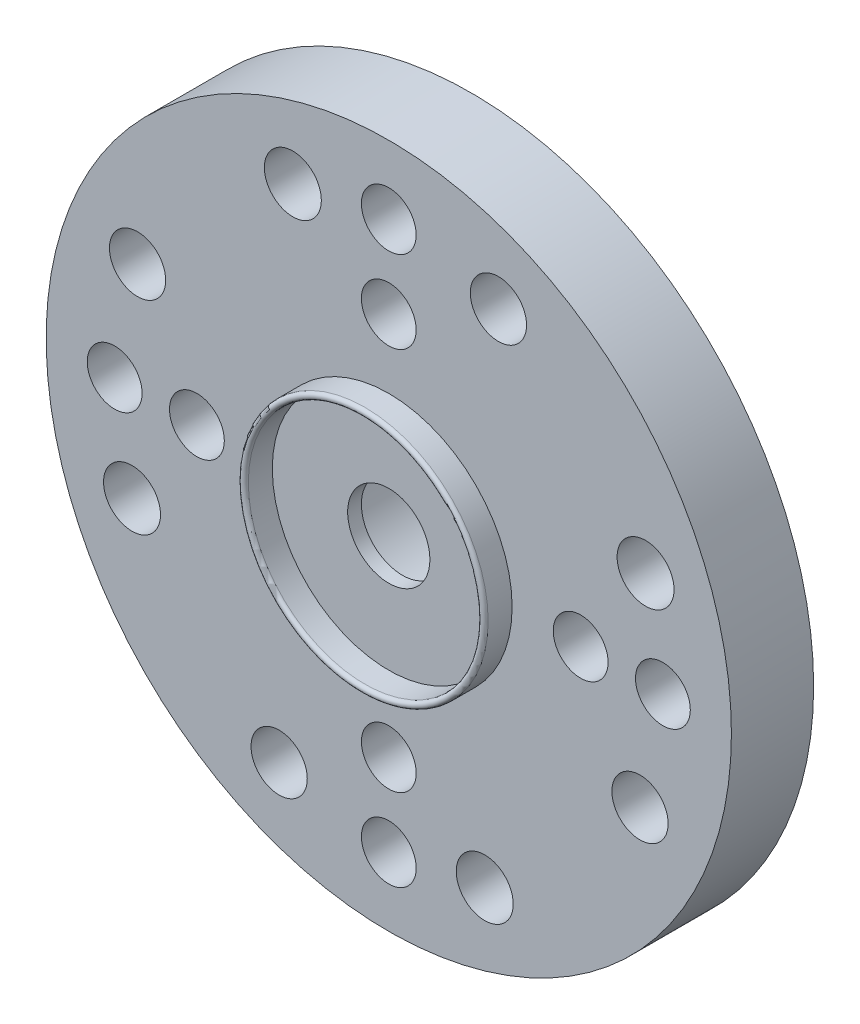
ISO-10303-21;
HEADER;
FILE_DESCRIPTION(('STEP AP214'),'2;1');
FILE_NAME('part.step','',(''),(''),'','','');
FILE_SCHEMA(('AUTOMOTIVE_DESIGN { 1 0 10303 214 1 1 1 1 }'));
ENDSEC;
DATA;
#1=APPLICATION_CONTEXT('core data for automotive mechanical design processes');
#2=APPLICATION_PROTOCOL_DEFINITION('international standard','automotive_design',2000,#1);
#3=PRODUCT_CONTEXT('',#1,'mechanical');
#4=PRODUCT('Part','Part','',(#3));
#5=PRODUCT_RELATED_PRODUCT_CATEGORY('part','',(#4));
#6=PRODUCT_DEFINITION_FORMATION('','',#4);
#7=PRODUCT_DEFINITION_CONTEXT('part definition',#1,'design');
#8=PRODUCT_DEFINITION('design','',#6,#7);
#9=PRODUCT_DEFINITION_SHAPE('','',#8);
#10=(LENGTH_UNIT() NAMED_UNIT(*) SI_UNIT(.MILLI.,.METRE.));
#11=(NAMED_UNIT(*) PLANE_ANGLE_UNIT() SI_UNIT($,.RADIAN.));
#12=(NAMED_UNIT(*) SI_UNIT($,.STERADIAN.) SOLID_ANGLE_UNIT());
#13=UNCERTAINTY_MEASURE_WITH_UNIT(LENGTH_MEASURE(1.E-05),#10,'distance_accuracy_value','');
#14=(GEOMETRIC_REPRESENTATION_CONTEXT(3) GLOBAL_UNCERTAINTY_ASSIGNED_CONTEXT((#13)) GLOBAL_UNIT_ASSIGNED_CONTEXT((#10,
#11,#12)) REPRESENTATION_CONTEXT('',''));
#15=CARTESIAN_POINT('',(0.,0.,0.));
#16=DIRECTION('',(0.,0.,1.));
#17=DIRECTION('',(1.,0.,0.));
#18=AXIS2_PLACEMENT_3D('',#15,#16,#17);
#19=CARTESIAN_POINT('',(0.,0.,3.875));
#20=DIRECTION('',(0.,0.,1.));
#21=DIRECTION('',(1.,0.,0.));
#22=AXIS2_PLACEMENT_3D('',#19,#20,#21);
#23=TOROIDAL_SURFACE('',#22,4.375,0.125);
#24=CARTESIAN_POINT('',(0.,0.,3.875));
#25=DIRECTION('',(0.,0.,1.));
#26=DIRECTION('',(1.,0.,0.));
#27=AXIS2_PLACEMENT_3D('',#24,#25,#26);
#28=CIRCLE('',#27,4.5);
#29=CARTESIAN_POINT('',(4.5,0.,3.875));
#30=VERTEX_POINT('',#29);
#31=EDGE_CURVE('E47',#30,#30,#28,.F.);
#32=ORIENTED_EDGE('',*,*,#31,.F.);
#33=EDGE_LOOP('',(#32));
#34=FACE_BOUND('',#33,.T.);
#35=CARTESIAN_POINT('',(0.,0.,3.875));
#36=DIRECTION('',(0.,0.,1.));
#37=DIRECTION('',(1.,0.,0.));
#38=AXIS2_PLACEMENT_3D('',#35,#36,#37);
#39=CIRCLE('',#38,4.25);
#40=CARTESIAN_POINT('',(4.25,0.,3.875));
#41=VERTEX_POINT('',#40);
#42=EDGE_CURVE('E10',#41,#41,#39,.T.);
#43=ORIENTED_EDGE('',*,*,#42,.F.);
#44=EDGE_LOOP('',(#43));
#45=FACE_BOUND('',#44,.T.);
#46=ADVANCED_FACE('F39',(#34,#45),#23,.T.);
#47=CARTESIAN_POINT('',(0.,0.,3.));
#48=DIRECTION('',(0.,0.,1.));
#49=DIRECTION('',(1.,0.,0.));
#50=AXIS2_PLACEMENT_3D('',#47,#48,#49);
#51=PLANE('',#50);
#52=CARTESIAN_POINT('',(0.,0.,3.));
#53=DIRECTION('',(0.,0.,1.));
#54=DIRECTION('',(1.,0.,0.));
#55=AXIS2_PLACEMENT_3D('',#52,#53,#54);
#56=CIRCLE('',#55,1.5);
#57=CARTESIAN_POINT('',(1.5,0.,3.));
#58=VERTEX_POINT('',#57);
#59=EDGE_CURVE('E68',#58,#58,#56,.T.);
#60=ORIENTED_EDGE('',*,*,#59,.F.);
#61=EDGE_LOOP('',(#60));
#62=FACE_BOUND('',#61,.T.);
#63=CARTESIAN_POINT('',(0.,0.,3.));
#64=DIRECTION('',(0.,0.,1.));
#65=DIRECTION('',(1.,0.,0.));
#66=AXIS2_PLACEMENT_3D('',#63,#64,#65);
#67=CIRCLE('',#66,4.25);
#68=CARTESIAN_POINT('',(4.25,0.,3.));
#69=VERTEX_POINT('',#68);
#70=EDGE_CURVE('E52',#69,#69,#67,.F.);
#71=ORIENTED_EDGE('',*,*,#70,.F.);
#72=EDGE_LOOP('',(#71));
#73=FACE_BOUND('',#72,.T.);
#74=ADVANCED_FACE('F234',(#62,#73),#51,.T.);
#75=CARTESIAN_POINT('',(0.,0.,0.));
#76=DIRECTION('',(0.,0.,1.));
#77=DIRECTION('',(1.,0.,0.));
#78=AXIS2_PLACEMENT_3D('',#75,#76,#77);
#79=PLANE('',#78);
#80=CARTESIAN_POINT('',(7.0000000000007,1.28837694184105E-12,0.));
#81=DIRECTION('',(0.,0.,1.));
#82=DIRECTION('',(1.,0.,0.));
#83=AXIS2_PLACEMENT_3D('',#80,#81,#82);
#84=CIRCLE('',#83,1.00000000000105);
#85=CARTESIAN_POINT('',(8.00000000000175,1.28837694184105E-12,0.));
#86=VERTEX_POINT('',#85);
#87=EDGE_CURVE('E95',#86,#86,#84,.T.);
#88=ORIENTED_EDGE('',*,*,#87,.T.);
#89=EDGE_LOOP('',(#88));
#90=FACE_BOUND('',#89,.T.);
#91=CARTESIAN_POINT('',(9.16515138991238,-3.99999999999871,0.));
#92=DIRECTION('',(0.,0.,1.));
#93=DIRECTION('',(1.,0.,0.));
#94=AXIS2_PLACEMENT_3D('',#91,#92,#93);
#95=CIRCLE('',#94,1.02583719279547);
#96=CARTESIAN_POINT('',(10.1909885827078,-3.99999999999871,0.));
#97=VERTEX_POINT('',#96);
#98=EDGE_CURVE('E99',#97,#97,#95,.T.);
#99=ORIENTED_EDGE('',*,*,#98,.T.);
#100=EDGE_LOOP('',(#99));
#101=FACE_BOUND('',#100,.T.);
#102=CARTESIAN_POINT('',(9.3674969975983,3.50000000000129,0.));
#103=DIRECTION('',(0.,0.,1.));
#104=DIRECTION('',(1.,0.,0.));
#105=AXIS2_PLACEMENT_3D('',#102,#103,#104);
#106=CIRCLE('',#105,1.03915751450506);
#107=CARTESIAN_POINT('',(10.4066545121034,3.50000000000129,0.));
#108=VERTEX_POINT('',#107);
#109=EDGE_CURVE('E103',#108,#108,#106,.T.);
#110=ORIENTED_EDGE('',*,*,#109,.T.);
#111=EDGE_LOOP('',(#110));
#112=FACE_BOUND('',#111,.T.);
#113=CARTESIAN_POINT('',(1.98838503019381E-12,-9.99999999999941,0.));
#114=DIRECTION('',(0.,0.,1.));
#115=DIRECTION('',(1.,0.,0.));
#116=AXIS2_PLACEMENT_3D('',#113,#114,#115);
#117=CIRCLE('',#116,1.00000000000214);
#118=CARTESIAN_POINT('',(1.00000000000413,-9.99999999999941,0.));
#119=VERTEX_POINT('',#118);
#120=EDGE_CURVE('E107',#119,#119,#117,.T.);
#121=ORIENTED_EDGE('',*,*,#120,.T.);
#122=EDGE_LOOP('',(#121));
#123=FACE_BOUND('',#122,.T.);
#124=CARTESIAN_POINT('',(0.,7.,0.));
#125=DIRECTION('',(0.,0.,1.));
#126=DIRECTION('',(1.,0.,0.));
#127=AXIS2_PLACEMENT_3D('',#124,#125,#126);
#128=CIRCLE('',#127,1.);
#129=CARTESIAN_POINT('',(1.,7.,0.));
#130=VERTEX_POINT('',#129);
#131=EDGE_CURVE('E111',#130,#130,#128,.T.);
#132=ORIENTED_EDGE('',*,*,#131,.T.);
#133=EDGE_LOOP('',(#132));
#134=FACE_BOUND('',#133,.T.);
#135=CARTESIAN_POINT('',(4.,9.16515138991168,0.));
#136=DIRECTION('',(0.,0.,1.));
#137=DIRECTION('',(1.,0.,0.));
#138=AXIS2_PLACEMENT_3D('',#135,#136,#137);
#139=CIRCLE('',#138,1.02583719279441);
#140=CARTESIAN_POINT('',(5.02583719279441,9.16515138991168,0.));
#141=VERTEX_POINT('',#140);
#142=EDGE_CURVE('E115',#141,#141,#139,.T.);
#143=ORIENTED_EDGE('',*,*,#142,.T.);
#144=EDGE_LOOP('',(#143));
#145=FACE_BOUND('',#144,.T.);
#146=CARTESIAN_POINT('',(-3.5,9.3674969975976,0.));
#147=DIRECTION('',(0.,0.,1.));
#148=DIRECTION('',(1.,0.,0.));
#149=AXIS2_PLACEMENT_3D('',#146,#147,#148);
#150=CIRCLE('',#149,1.03915751450399);
#151=CARTESIAN_POINT('',(-2.46084248549601,9.3674969975976,0.));
#152=VERTEX_POINT('',#151);
#153=EDGE_CURVE('E119',#152,#152,#150,.T.);
#154=ORIENTED_EDGE('',*,*,#153,.T.);
#155=EDGE_LOOP('',(#154));
#156=FACE_BOUND('',#155,.T.);
#157=CARTESIAN_POINT('',(10.0000000000007,1.28892803290067E-12,0.));
#158=DIRECTION('',(0.,0.,1.));
#159=DIRECTION('',(1.,0.,0.));
#160=AXIS2_PLACEMENT_3D('',#157,#158,#159);
#161=CIRCLE('',#160,1.00000000000106);
#162=CARTESIAN_POINT('',(11.0000000000018,1.28892803290067E-12,0.));
#163=VERTEX_POINT('',#162);
#164=EDGE_CURVE('E123',#163,#163,#161,.T.);
#165=ORIENTED_EDGE('',*,*,#164,.T.);
#166=EDGE_LOOP('',(#165));
#167=FACE_BOUND('',#166,.T.);
#168=CARTESIAN_POINT('',(-9.36749699759631,-3.5000000000007,0.));
#169=DIRECTION('',(0.,0.,1.));
#170=DIRECTION('',(1.,0.,0.));
#171=AXIS2_PLACEMENT_3D('',#168,#169,#170);
#172=CIRCLE('',#171,1.03915751450514);
#173=CARTESIAN_POINT('',(-8.32833948309117,-3.5000000000007,0.));
#174=VERTEX_POINT('',#173);
#175=EDGE_CURVE('E127',#174,#174,#172,.T.);
#176=ORIENTED_EDGE('',*,*,#175,.T.);
#177=EDGE_LOOP('',(#176));
#178=FACE_BOUND('',#177,.T.);
#179=CARTESIAN_POINT('',(-9.16515138991039,3.9999999999993,0.));
#180=DIRECTION('',(0.,0.,1.));
#181=DIRECTION('',(1.,0.,0.));
#182=AXIS2_PLACEMENT_3D('',#179,#180,#181);
#183=CIRCLE('',#182,1.02583719279554);
#184=CARTESIAN_POINT('',(-8.13931419711485,3.9999999999993,0.));
#185=VERTEX_POINT('',#184);
#186=EDGE_CURVE('E131',#185,#185,#183,.T.);
#187=ORIENTED_EDGE('',*,*,#186,.T.);
#188=EDGE_LOOP('',(#187));
#189=FACE_BOUND('',#188,.T.);
#190=CARTESIAN_POINT('',(-6.99999999999871,-6.9942821276834E-13,0.));
#191=DIRECTION('',(0.,0.,1.));
#192=DIRECTION('',(1.,0.,0.));
#193=AXIS2_PLACEMENT_3D('',#190,#191,#192);
#194=CIRCLE('',#193,1.00000000000112);
#195=CARTESIAN_POINT('',(-5.99999999999759,-6.9942821276834E-13,0.));
#196=VERTEX_POINT('',#195);
#197=EDGE_CURVE('E135',#196,#196,#194,.T.);
#198=ORIENTED_EDGE('',*,*,#197,.T.);
#199=EDGE_LOOP('',(#198));
#200=FACE_BOUND('',#199,.T.);
#201=CARTESIAN_POINT('',(1.98765024211432E-12,-6.99999999999941,0.));
#202=DIRECTION('',(0.,0.,1.));
#203=DIRECTION('',(1.,0.,0.));
#204=AXIS2_PLACEMENT_3D('',#201,#202,#203);
#205=CIRCLE('',#204,1.00000000000212);
#206=CARTESIAN_POINT('',(1.00000000000411,-6.99999999999941,0.));
#207=VERTEX_POINT('',#206);
#208=EDGE_CURVE('E139',#207,#207,#205,.T.);
#209=ORIENTED_EDGE('',*,*,#208,.T.);
#210=EDGE_LOOP('',(#209));
#211=FACE_BOUND('',#210,.T.);
#212=CARTESIAN_POINT('',(-3.99999999999801,-9.16515138991109,0.));
#213=DIRECTION('',(0.,0.,1.));
#214=DIRECTION('',(1.,0.,0.));
#215=AXIS2_PLACEMENT_3D('',#212,#213,#214);
#216=CIRCLE('',#215,1.02583719279654);
#217=CARTESIAN_POINT('',(-2.97416280720147,-9.16515138991109,0.));
#218=VERTEX_POINT('',#217);
#219=EDGE_CURVE('E143',#218,#218,#216,.T.);
#220=ORIENTED_EDGE('',*,*,#219,.T.);
#221=EDGE_LOOP('',(#220));
#222=FACE_BOUND('',#221,.T.);
#223=CARTESIAN_POINT('',(3.50000000000199,-9.36749699759701,0.));
#224=DIRECTION('',(0.,0.,1.));
#225=DIRECTION('',(1.,0.,0.));
#226=AXIS2_PLACEMENT_3D('',#223,#224,#225);
#227=CIRCLE('',#226,1.03915751450614);
#228=CARTESIAN_POINT('',(4.53915751450813,-9.36749699759701,0.));
#229=VERTEX_POINT('',#228);
#230=EDGE_CURVE('E147',#229,#229,#227,.T.);
#231=ORIENTED_EDGE('',*,*,#230,.T.);
#232=EDGE_LOOP('',(#231));
#233=FACE_BOUND('',#232,.T.);
#234=CARTESIAN_POINT('',(-9.99999999999871,-7.003466978677E-13,0.));
#235=DIRECTION('',(0.,0.,1.));
#236=DIRECTION('',(1.,0.,0.));
#237=AXIS2_PLACEMENT_3D('',#234,#235,#236);
#238=CIRCLE('',#237,1.00000000000115);
#239=CARTESIAN_POINT('',(-8.99999999999756,-7.003466978677E-13,0.));
#240=VERTEX_POINT('',#239);
#241=EDGE_CURVE('E151',#240,#240,#238,.T.);
#242=ORIENTED_EDGE('',*,*,#241,.T.);
#243=EDGE_LOOP('',(#242));
#244=FACE_BOUND('',#243,.T.);
#245=CARTESIAN_POINT('',(0.,10.,0.));
#246=DIRECTION('',(0.,0.,1.));
#247=DIRECTION('',(1.,0.,0.));
#248=AXIS2_PLACEMENT_3D('',#245,#246,#247);
#249=CIRCLE('',#248,1.);
#250=CARTESIAN_POINT('',(1.,10.,0.));
#251=VERTEX_POINT('',#250);
#252=EDGE_CURVE('E155',#251,#251,#249,.T.);
#253=ORIENTED_EDGE('',*,*,#252,.T.);
#254=EDGE_LOOP('',(#253));
#255=FACE_BOUND('',#254,.T.);
#256=CARTESIAN_POINT('',(0.,0.,0.));
#257=DIRECTION('',(0.,0.,1.));
#258=DIRECTION('',(1.,0.,0.));
#259=AXIS2_PLACEMENT_3D('',#256,#257,#258);
#260=CIRCLE('',#259,12.5);
#261=CARTESIAN_POINT('',(12.5,0.,0.));
#262=VERTEX_POINT('',#261);
#263=EDGE_CURVE('E70',#262,#262,#260,.T.);
#264=ORIENTED_EDGE('',*,*,#263,.F.);
#265=EDGE_LOOP('',(#264));
#266=FACE_BOUND('',#265,.T.);
#267=CARTESIAN_POINT('',(0.,0.,0.));
#268=DIRECTION('',(0.,0.,1.));
#269=DIRECTION('',(1.,0.,0.));
#270=AXIS2_PLACEMENT_3D('',#267,#268,#269);
#271=CIRCLE('',#270,4.5);
#272=CARTESIAN_POINT('',(4.5,0.,0.));
#273=VERTEX_POINT('',#272);
#274=EDGE_CURVE('E57',#273,#273,#271,.F.);
#275=ORIENTED_EDGE('',*,*,#274,.F.);
#276=EDGE_LOOP('',(#275));
#277=FACE_BOUND('',#276,.T.);
#278=ADVANCED_FACE('F251',(#90,#101,#112,#123,#134,#145,#156,#167,#178,#189,#200,#211,#222,#233,
#244,#255,#266,#277),#79,.F.);
#279=CARTESIAN_POINT('',(0.,0.,3.));
#280=DIRECTION('',(0.,0.,-1.));
#281=DIRECTION('',(-1.,0.,0.));
#282=AXIS2_PLACEMENT_3D('',#279,#280,#281);
#283=CYLINDRICAL_SURFACE('',#282,12.5);
#284=CARTESIAN_POINT('',(0.,0.,3.));
#285=DIRECTION('',(0.,0.,1.));
#286=DIRECTION('',(1.,0.,0.));
#287=AXIS2_PLACEMENT_3D('',#284,#285,#286);
#288=CIRCLE('',#287,12.5);
#289=CARTESIAN_POINT('',(12.5,0.,3.));
#290=VERTEX_POINT('',#289);
#291=EDGE_CURVE('E63',#290,#290,#288,.T.);
#292=ORIENTED_EDGE('',*,*,#291,.F.);
#293=EDGE_LOOP('',(#292));
#294=FACE_BOUND('',#293,.T.);
#295=ORIENTED_EDGE('',*,*,#263,.T.);
#296=EDGE_LOOP('',(#295));
#297=FACE_BOUND('',#296,.T.);
#298=ADVANCED_FACE('F231',(#294,#297),#283,.T.);
#299=CARTESIAN_POINT('',(7.0000000000007,1.28837694184105E-12,3.));
#300=DIRECTION('',(0.,0.,1.));
#301=DIRECTION('',(1.,0.,0.));
#302=AXIS2_PLACEMENT_3D('',#299,#300,#301);
#303=CIRCLE('',#302,1.00000000000105);
#304=CARTESIAN_POINT('',(8.00000000000175,1.28837694184105E-12,3.));
#305=VERTEX_POINT('',#304);
#306=EDGE_CURVE('E176',#305,#305,#303,.T.);
#307=ORIENTED_EDGE('',*,*,#306,.F.);
#308=EDGE_LOOP('',(#307));
#309=FACE_BOUND('',#308,.T.);
#310=CARTESIAN_POINT('',(9.16515138991238,-3.99999999999871,3.));
#311=DIRECTION('',(0.,0.,1.));
#312=DIRECTION('',(1.,0.,0.));
#313=AXIS2_PLACEMENT_3D('',#310,#311,#312);
#314=CIRCLE('',#313,1.02583719279547);
#315=CARTESIAN_POINT('',(10.1909885827078,-3.99999999999871,3.));
#316=VERTEX_POINT('',#315);
#317=EDGE_CURVE('E180',#316,#316,#314,.T.);
#318=ORIENTED_EDGE('',*,*,#317,.F.);
#319=EDGE_LOOP('',(#318));
#320=FACE_BOUND('',#319,.T.);
#321=CARTESIAN_POINT('',(9.3674969975983,3.50000000000129,3.));
#322=DIRECTION('',(0.,0.,1.));
#323=DIRECTION('',(1.,0.,0.));
#324=AXIS2_PLACEMENT_3D('',#321,#322,#323);
#325=CIRCLE('',#324,1.03915751450506);
#326=CARTESIAN_POINT('',(10.4066545121034,3.50000000000129,3.));
#327=VERTEX_POINT('',#326);
#328=EDGE_CURVE('E184',#327,#327,#325,.T.);
#329=ORIENTED_EDGE('',*,*,#328,.F.);
#330=EDGE_LOOP('',(#329));
#331=FACE_BOUND('',#330,.T.);
#332=CARTESIAN_POINT('',(1.98838503019381E-12,-9.99999999999941,3.));
#333=DIRECTION('',(0.,0.,1.));
#334=DIRECTION('',(1.,0.,0.));
#335=AXIS2_PLACEMENT_3D('',#332,#333,#334);
#336=CIRCLE('',#335,1.00000000000214);
#337=CARTESIAN_POINT('',(1.00000000000413,-9.99999999999941,3.));
#338=VERTEX_POINT('',#337);
#339=EDGE_CURVE('E188',#338,#338,#336,.T.);
#340=ORIENTED_EDGE('',*,*,#339,.F.);
#341=EDGE_LOOP('',(#340));
#342=FACE_BOUND('',#341,.T.);
#343=CARTESIAN_POINT('',(0.,7.,3.));
#344=DIRECTION('',(0.,0.,1.));
#345=DIRECTION('',(1.,0.,0.));
#346=AXIS2_PLACEMENT_3D('',#343,#344,#345);
#347=CIRCLE('',#346,1.);
#348=CARTESIAN_POINT('',(1.,7.,3.));
#349=VERTEX_POINT('',#348);
#350=EDGE_CURVE('E163',#349,#349,#347,.T.);
#351=ORIENTED_EDGE('',*,*,#350,.F.);
#352=EDGE_LOOP('',(#351));
#353=FACE_BOUND('',#352,.T.);
#354=CARTESIAN_POINT('',(4.,9.16515138991168,3.));
#355=DIRECTION('',(0.,0.,1.));
#356=DIRECTION('',(1.,0.,0.));
#357=AXIS2_PLACEMENT_3D('',#354,#355,#356);
#358=CIRCLE('',#357,1.02583719279441);
#359=CARTESIAN_POINT('',(5.02583719279441,9.16515138991168,3.));
#360=VERTEX_POINT('',#359);
#361=EDGE_CURVE('E164',#360,#360,#358,.T.);
#362=ORIENTED_EDGE('',*,*,#361,.F.);
#363=EDGE_LOOP('',(#362));
#364=FACE_BOUND('',#363,.T.);
#365=CARTESIAN_POINT('',(-3.5,9.3674969975976,3.));
#366=DIRECTION('',(0.,0.,1.));
#367=DIRECTION('',(1.,0.,0.));
#368=AXIS2_PLACEMENT_3D('',#365,#366,#367);
#369=CIRCLE('',#368,1.03915751450399);
#370=CARTESIAN_POINT('',(-2.46084248549601,9.3674969975976,3.));
#371=VERTEX_POINT('',#370);
#372=EDGE_CURVE('E168',#371,#371,#369,.T.);
#373=ORIENTED_EDGE('',*,*,#372,.F.);
#374=EDGE_LOOP('',(#373));
#375=FACE_BOUND('',#374,.T.);
#376=CARTESIAN_POINT('',(10.0000000000007,1.28892803290067E-12,3.));
#377=DIRECTION('',(0.,0.,1.));
#378=DIRECTION('',(1.,0.,0.));
#379=AXIS2_PLACEMENT_3D('',#376,#377,#378);
#380=CIRCLE('',#379,1.00000000000106);
#381=CARTESIAN_POINT('',(11.0000000000018,1.28892803290067E-12,3.));
#382=VERTEX_POINT('',#381);
#383=EDGE_CURVE('E172',#382,#382,#380,.T.);
#384=ORIENTED_EDGE('',*,*,#383,.F.);
#385=EDGE_LOOP('',(#384));
#386=FACE_BOUND('',#385,.T.);
#387=CARTESIAN_POINT('',(-9.36749699759631,-3.5000000000007,3.));
#388=DIRECTION('',(0.,0.,1.));
#389=DIRECTION('',(1.,0.,0.));
#390=AXIS2_PLACEMENT_3D('',#387,#388,#389);
#391=CIRCLE('',#390,1.03915751450514);
#392=CARTESIAN_POINT('',(-8.32833948309117,-3.5000000000007,3.));
#393=VERTEX_POINT('',#392);
#394=EDGE_CURVE('E212',#393,#393,#391,.T.);
#395=ORIENTED_EDGE('',*,*,#394,.F.);
#396=EDGE_LOOP('',(#395));
#397=FACE_BOUND('',#396,.T.);
#398=CARTESIAN_POINT('',(-9.16515138991039,3.9999999999993,3.));
#399=DIRECTION('',(0.,0.,1.));
#400=DIRECTION('',(1.,0.,0.));
#401=AXIS2_PLACEMENT_3D('',#398,#399,#400);
#402=CIRCLE('',#401,1.02583719279554);
#403=CARTESIAN_POINT('',(-8.13931419711485,3.9999999999993,3.));
#404=VERTEX_POINT('',#403);
#405=EDGE_CURVE('E216',#404,#404,#402,.T.);
#406=ORIENTED_EDGE('',*,*,#405,.F.);
#407=EDGE_LOOP('',(#406));
#408=FACE_BOUND('',#407,.T.);
#409=CARTESIAN_POINT('',(-6.99999999999871,-6.9942821276834E-13,3.));
#410=DIRECTION('',(0.,0.,1.));
#411=DIRECTION('',(1.,0.,0.));
#412=AXIS2_PLACEMENT_3D('',#409,#410,#411);
#413=CIRCLE('',#412,1.00000000000112);
#414=CARTESIAN_POINT('',(-5.99999999999759,-6.9942821276834E-13,3.));
#415=VERTEX_POINT('',#414);
#416=EDGE_CURVE('E208',#415,#415,#413,.T.);
#417=ORIENTED_EDGE('',*,*,#416,.F.);
#418=EDGE_LOOP('',(#417));
#419=FACE_BOUND('',#418,.T.);
#420=CARTESIAN_POINT('',(1.98765024211432E-12,-6.99999999999941,3.));
#421=DIRECTION('',(0.,0.,1.));
#422=DIRECTION('',(1.,0.,0.));
#423=AXIS2_PLACEMENT_3D('',#420,#421,#422);
#424=CIRCLE('',#423,1.00000000000212);
#425=CARTESIAN_POINT('',(1.00000000000411,-6.99999999999941,3.));
#426=VERTEX_POINT('',#425);
#427=EDGE_CURVE('E192',#426,#426,#424,.T.);
#428=ORIENTED_EDGE('',*,*,#427,.F.);
#429=EDGE_LOOP('',(#428));
#430=FACE_BOUND('',#429,.T.);
#431=CARTESIAN_POINT('',(-3.99999999999801,-9.16515138991109,3.));
#432=DIRECTION('',(0.,0.,1.));
#433=DIRECTION('',(1.,0.,0.));
#434=AXIS2_PLACEMENT_3D('',#431,#432,#433);
#435=CIRCLE('',#434,1.02583719279654);
#436=CARTESIAN_POINT('',(-2.97416280720147,-9.16515138991109,3.));
#437=VERTEX_POINT('',#436);
#438=EDGE_CURVE('E196',#437,#437,#435,.T.);
#439=ORIENTED_EDGE('',*,*,#438,.F.);
#440=EDGE_LOOP('',(#439));
#441=FACE_BOUND('',#440,.T.);
#442=CARTESIAN_POINT('',(3.50000000000199,-9.36749699759701,3.));
#443=DIRECTION('',(0.,0.,1.));
#444=DIRECTION('',(1.,0.,0.));
#445=AXIS2_PLACEMENT_3D('',#442,#443,#444);
#446=CIRCLE('',#445,1.03915751450614);
#447=CARTESIAN_POINT('',(4.53915751450813,-9.36749699759701,3.));
#448=VERTEX_POINT('',#447);
#449=EDGE_CURVE('E200',#448,#448,#446,.T.);
#450=ORIENTED_EDGE('',*,*,#449,.F.);
#451=EDGE_LOOP('',(#450));
#452=FACE_BOUND('',#451,.T.);
#453=CARTESIAN_POINT('',(-9.99999999999871,-7.003466978677E-13,3.));
#454=DIRECTION('',(0.,0.,1.));
#455=DIRECTION('',(1.,0.,0.));
#456=AXIS2_PLACEMENT_3D('',#453,#454,#455);
#457=CIRCLE('',#456,1.00000000000115);
#458=CARTESIAN_POINT('',(-8.99999999999756,-7.003466978677E-13,3.));
#459=VERTEX_POINT('',#458);
#460=EDGE_CURVE('E204',#459,#459,#457,.T.);
#461=ORIENTED_EDGE('',*,*,#460,.F.);
#462=EDGE_LOOP('',(#461));
#463=FACE_BOUND('',#462,.T.);
#464=CARTESIAN_POINT('',(0.,10.,3.));
#465=DIRECTION('',(0.,0.,1.));
#466=DIRECTION('',(1.,0.,0.));
#467=AXIS2_PLACEMENT_3D('',#464,#465,#466);
#468=CIRCLE('',#467,1.);
#469=CARTESIAN_POINT('',(1.,10.,3.));
#470=VERTEX_POINT('',#469);
#471=EDGE_CURVE('E159',#470,#470,#468,.T.);
#472=ORIENTED_EDGE('',*,*,#471,.F.);
#473=EDGE_LOOP('',(#472));
#474=FACE_BOUND('',#473,.T.);
#475=CARTESIAN_POINT('',(0.,0.,3.));
#476=DIRECTION('',(0.,0.,1.));
#477=DIRECTION('',(1.,0.,0.));
#478=AXIS2_PLACEMENT_3D('',#475,#476,#477);
#479=CIRCLE('',#478,4.5);
#480=CARTESIAN_POINT('',(4.5,0.,3.));
#481=VERTEX_POINT('',#480);
#482=EDGE_CURVE('E91',#481,#481,#479,.T.);
#483=ORIENTED_EDGE('',*,*,#482,.F.);
#484=EDGE_LOOP('',(#483));
#485=FACE_BOUND('',#484,.T.);
#486=ORIENTED_EDGE('',*,*,#291,.T.);
#487=EDGE_LOOP('',(#486));
#488=FACE_BOUND('',#487,.T.);
#489=ADVANCED_FACE('F227',(#309,#320,#331,#342,#353,#364,#375,#386,#397,#408,#419,#430,#441,
#452,#463,#474,#485,#488),#51,.T.);
#490=CARTESIAN_POINT('',(0.,0.,2.5));
#491=DIRECTION('',(0.,0.,-1.));
#492=DIRECTION('',(-1.,0.,0.));
#493=AXIS2_PLACEMENT_3D('',#490,#491,#492);
#494=CYLINDRICAL_SURFACE('',#493,3.);
#495=CARTESIAN_POINT('',(0.,0.,2.5));
#496=DIRECTION('',(0.,0.,1.));
#497=DIRECTION('',(1.,0.,0.));
#498=AXIS2_PLACEMENT_3D('',#495,#496,#497);
#499=CIRCLE('',#498,3.);
#500=CARTESIAN_POINT('',(3.,0.,2.5));
#501=VERTEX_POINT('',#500);
#502=EDGE_CURVE('E74',#501,#501,#499,.T.);
#503=ORIENTED_EDGE('',*,*,#502,.T.);
#504=EDGE_LOOP('',(#503));
#505=FACE_BOUND('',#504,.T.);
#506=CARTESIAN_POINT('',(0.,0.,-4.));
#507=DIRECTION('',(0.,0.,-1.));
#508=DIRECTION('',(-1.,0.,0.));
#509=AXIS2_PLACEMENT_3D('',#506,#507,#508);
#510=CIRCLE('',#509,3.);
#511=CARTESIAN_POINT('',(-3.,0.,-4.));
#512=VERTEX_POINT('',#511);
#513=EDGE_CURVE('E87',#512,#512,#510,.T.);
#514=ORIENTED_EDGE('',*,*,#513,.T.);
#515=EDGE_LOOP('',(#514));
#516=FACE_BOUND('',#515,.T.);
#517=ADVANCED_FACE('F230',(#505,#516),#494,.F.);
#518=CARTESIAN_POINT('',(0.,0.,2.5));
#519=DIRECTION('',(0.,0.,1.));
#520=DIRECTION('',(1.,0.,0.));
#521=AXIS2_PLACEMENT_3D('',#518,#519,#520);
#522=PLANE('',#521);
#523=CARTESIAN_POINT('',(0.,0.,2.5));
#524=DIRECTION('',(0.,0.,1.));
#525=DIRECTION('',(1.,0.,0.));
#526=AXIS2_PLACEMENT_3D('',#523,#524,#525);
#527=CIRCLE('',#526,1.5);
#528=CARTESIAN_POINT('',(1.5,0.,2.5));
#529=VERTEX_POINT('',#528);
#530=EDGE_CURVE('E64',#529,#529,#527,.T.);
#531=ORIENTED_EDGE('',*,*,#530,.T.);
#532=EDGE_LOOP('',(#531));
#533=FACE_BOUND('',#532,.T.);
#534=ORIENTED_EDGE('',*,*,#502,.F.);
#535=EDGE_LOOP('',(#534));
#536=FACE_BOUND('',#535,.T.);
#537=ADVANCED_FACE('F291',(#533,#536),#522,.F.);
#538=CARTESIAN_POINT('',(0.,0.,4.5));
#539=DIRECTION('',(0.,0.,-1.));
#540=DIRECTION('',(-1.,0.,0.));
#541=AXIS2_PLACEMENT_3D('',#538,#539,#540);
#542=CYLINDRICAL_SURFACE('',#541,1.5);
#543=ORIENTED_EDGE('',*,*,#59,.T.);
#544=EDGE_LOOP('',(#543));
#545=FACE_BOUND('',#544,.T.);
#546=ORIENTED_EDGE('',*,*,#530,.F.);
#547=EDGE_LOOP('',(#546));
#548=FACE_BOUND('',#547,.T.);
#549=ADVANCED_FACE('F272',(#545,#548),#542,.F.);
#550=CARTESIAN_POINT('',(0.,0.,-4.));
#551=DIRECTION('',(0.,0.,-1.));
#552=DIRECTION('',(-1.,0.,0.));
#553=AXIS2_PLACEMENT_3D('',#550,#551,#552);
#554=PLANE('',#553);
#555=CARTESIAN_POINT('',(0.,0.,-4.));
#556=DIRECTION('',(0.,0.,-1.));
#557=DIRECTION('',(-1.,0.,0.));
#558=AXIS2_PLACEMENT_3D('',#555,#556,#557);
#559=CIRCLE('',#558,4.5);
#560=CARTESIAN_POINT('',(-4.5,0.,-4.));
#561=VERTEX_POINT('',#560);
#562=EDGE_CURVE('E69',#561,#561,#559,.T.);
#563=ORIENTED_EDGE('',*,*,#562,.T.);
#564=EDGE_LOOP('',(#563));
#565=FACE_BOUND('',#564,.T.);
#566=ORIENTED_EDGE('',*,*,#513,.F.);
#567=EDGE_LOOP('',(#566));
#568=FACE_BOUND('',#567,.T.);
#569=ADVANCED_FACE('F263',(#565,#568),#554,.T.);
#570=CARTESIAN_POINT('',(0.,0.,-4.));
#571=DIRECTION('',(0.,0.,1.));
#572=DIRECTION('',(1.,0.,0.));
#573=AXIS2_PLACEMENT_3D('',#570,#571,#572);
#574=CYLINDRICAL_SURFACE('',#573,4.5);
#575=ORIENTED_EDGE('',*,*,#562,.F.);
#576=EDGE_LOOP('',(#575));
#577=FACE_BOUND('',#576,.T.);
#578=ORIENTED_EDGE('',*,*,#274,.T.);
#579=EDGE_LOOP('',(#578));
#580=FACE_BOUND('',#579,.T.);
#581=ADVANCED_FACE('F260',(#577,#580),#574,.T.);
#582=CARTESIAN_POINT('',(0.,0.,4.));
#583=DIRECTION('',(0.,0.,-1.));
#584=DIRECTION('',(-1.,0.,0.));
#585=AXIS2_PLACEMENT_3D('',#582,#583,#584);
#586=CYLINDRICAL_SURFACE('',#585,4.5);
#587=ORIENTED_EDGE('',*,*,#31,.T.);
#588=EDGE_LOOP('',(#587));
#589=FACE_BOUND('',#588,.T.);
#590=ORIENTED_EDGE('',*,*,#482,.T.);
#591=EDGE_LOOP('',(#590));
#592=FACE_BOUND('',#591,.T.);
#593=ADVANCED_FACE('F262',(#589,#592),#586,.T.);
#594=CARTESIAN_POINT('',(0.,0.,4.));
#595=DIRECTION('',(0.,0.,-1.));
#596=DIRECTION('',(-1.,0.,0.));
#597=AXIS2_PLACEMENT_3D('',#594,#595,#596);
#598=CYLINDRICAL_SURFACE('',#597,4.25);
#599=ORIENTED_EDGE('',*,*,#42,.T.);
#600=EDGE_LOOP('',(#599));
#601=FACE_BOUND('',#600,.T.);
#602=ORIENTED_EDGE('',*,*,#70,.T.);
#603=EDGE_LOOP('',(#602));
#604=FACE_BOUND('',#603,.T.);
#605=ADVANCED_FACE('F270',(#601,#604),#598,.F.);
#606=CARTESIAN_POINT('',(0.,10.,-5.));
#607=DIRECTION('',(0.,0.,1.));
#608=DIRECTION('',(1.,0.,0.));
#609=AXIS2_PLACEMENT_3D('',#606,#607,#608);
#610=CYLINDRICAL_SURFACE('',#609,1.);
#611=ORIENTED_EDGE('',*,*,#471,.T.);
#612=EDGE_LOOP('',(#611));
#613=FACE_BOUND('',#612,.T.);
#614=ORIENTED_EDGE('',*,*,#252,.F.);
#615=EDGE_LOOP('',(#614));
#616=FACE_BOUND('',#615,.T.);
#617=ADVANCED_FACE('F343',(#613,#616),#610,.F.);
#618=CARTESIAN_POINT('',(-9.99999999999871,-7.003466978677E-13,-5.));
#619=DIRECTION('',(0.,0.,1.));
#620=DIRECTION('',(1.,0.,0.));
#621=AXIS2_PLACEMENT_3D('',#618,#619,#620);
#622=CYLINDRICAL_SURFACE('',#621,1.00000000000115);
#623=ORIENTED_EDGE('',*,*,#460,.T.);
#624=EDGE_LOOP('',(#623));
#625=FACE_BOUND('',#624,.T.);
#626=ORIENTED_EDGE('',*,*,#241,.F.);
#627=EDGE_LOOP('',(#626));
#628=FACE_BOUND('',#627,.T.);
#629=ADVANCED_FACE('F365',(#625,#628),#622,.F.);
#630=CARTESIAN_POINT('',(3.50000000000199,-9.36749699759701,-5.));
#631=DIRECTION('',(0.,0.,1.));
#632=DIRECTION('',(1.,0.,0.));
#633=AXIS2_PLACEMENT_3D('',#630,#631,#632);
#634=CYLINDRICAL_SURFACE('',#633,1.03915751450614);
#635=ORIENTED_EDGE('',*,*,#449,.T.);
#636=EDGE_LOOP('',(#635));
#637=FACE_BOUND('',#636,.T.);
#638=ORIENTED_EDGE('',*,*,#230,.F.);
#639=EDGE_LOOP('',(#638));
#640=FACE_BOUND('',#639,.T.);
#641=ADVANCED_FACE('F375',(#637,#640),#634,.F.);
#642=CARTESIAN_POINT('',(-3.99999999999801,-9.16515138991109,-5.));
#643=DIRECTION('',(0.,0.,1.));
#644=DIRECTION('',(1.,0.,0.));
#645=AXIS2_PLACEMENT_3D('',#642,#643,#644);
#646=CYLINDRICAL_SURFACE('',#645,1.02583719279654);
#647=ORIENTED_EDGE('',*,*,#438,.T.);
#648=EDGE_LOOP('',(#647));
#649=FACE_BOUND('',#648,.T.);
#650=ORIENTED_EDGE('',*,*,#219,.F.);
#651=EDGE_LOOP('',(#650));
#652=FACE_BOUND('',#651,.T.);
#653=ADVANCED_FACE('F385',(#649,#652),#646,.F.);
#654=CARTESIAN_POINT('',(1.98765024211432E-12,-6.99999999999941,-5.));
#655=DIRECTION('',(0.,0.,1.));
#656=DIRECTION('',(1.,0.,0.));
#657=AXIS2_PLACEMENT_3D('',#654,#655,#656);
#658=CYLINDRICAL_SURFACE('',#657,1.00000000000212);
#659=ORIENTED_EDGE('',*,*,#427,.T.);
#660=EDGE_LOOP('',(#659));
#661=FACE_BOUND('',#660,.T.);
#662=ORIENTED_EDGE('',*,*,#208,.F.);
#663=EDGE_LOOP('',(#662));
#664=FACE_BOUND('',#663,.T.);
#665=ADVANCED_FACE('F395',(#661,#664),#658,.F.);
#666=CARTESIAN_POINT('',(-6.99999999999871,-6.9942821276834E-13,-5.));
#667=DIRECTION('',(0.,0.,1.));
#668=DIRECTION('',(1.,0.,0.));
#669=AXIS2_PLACEMENT_3D('',#666,#667,#668);
#670=CYLINDRICAL_SURFACE('',#669,1.00000000000112);
#671=ORIENTED_EDGE('',*,*,#416,.T.);
#672=EDGE_LOOP('',(#671));
#673=FACE_BOUND('',#672,.T.);
#674=ORIENTED_EDGE('',*,*,#197,.F.);
#675=EDGE_LOOP('',(#674));
#676=FACE_BOUND('',#675,.T.);
#677=ADVANCED_FACE('F224',(#673,#676),#670,.F.);
#678=CARTESIAN_POINT('',(-9.16515138991039,3.9999999999993,-5.));
#679=DIRECTION('',(0.,0.,1.));
#680=DIRECTION('',(1.,0.,0.));
#681=AXIS2_PLACEMENT_3D('',#678,#679,#680);
#682=CYLINDRICAL_SURFACE('',#681,1.02583719279554);
#683=ORIENTED_EDGE('',*,*,#405,.T.);
#684=EDGE_LOOP('',(#683));
#685=FACE_BOUND('',#684,.T.);
#686=ORIENTED_EDGE('',*,*,#186,.F.);
#687=EDGE_LOOP('',(#686));
#688=FACE_BOUND('',#687,.T.);
#689=ADVANCED_FACE('F414',(#685,#688),#682,.F.);
#690=CARTESIAN_POINT('',(-9.36749699759631,-3.5000000000007,-5.));
#691=DIRECTION('',(0.,0.,1.));
#692=DIRECTION('',(1.,0.,0.));
#693=AXIS2_PLACEMENT_3D('',#690,#691,#692);
#694=CYLINDRICAL_SURFACE('',#693,1.03915751450514);
#695=ORIENTED_EDGE('',*,*,#394,.T.);
#696=EDGE_LOOP('',(#695));
#697=FACE_BOUND('',#696,.T.);
#698=ORIENTED_EDGE('',*,*,#175,.F.);
#699=EDGE_LOOP('',(#698));
#700=FACE_BOUND('',#699,.T.);
#701=ADVANCED_FACE('F423',(#697,#700),#694,.F.);
#702=CARTESIAN_POINT('',(10.0000000000007,1.28892803290067E-12,-5.));
#703=DIRECTION('',(0.,0.,1.));
#704=DIRECTION('',(1.,0.,0.));
#705=AXIS2_PLACEMENT_3D('',#702,#703,#704);
#706=CYLINDRICAL_SURFACE('',#705,1.00000000000106);
#707=ORIENTED_EDGE('',*,*,#383,.T.);
#708=EDGE_LOOP('',(#707));
#709=FACE_BOUND('',#708,.T.);
#710=ORIENTED_EDGE('',*,*,#164,.F.);
#711=EDGE_LOOP('',(#710));
#712=FACE_BOUND('',#711,.T.);
#713=ADVANCED_FACE('F433',(#709,#712),#706,.F.);
#714=CARTESIAN_POINT('',(-3.5,9.3674969975976,-5.));
#715=DIRECTION('',(0.,0.,1.));
#716=DIRECTION('',(1.,0.,0.));
#717=AXIS2_PLACEMENT_3D('',#714,#715,#716);
#718=CYLINDRICAL_SURFACE('',#717,1.03915751450399);
#719=ORIENTED_EDGE('',*,*,#372,.T.);
#720=EDGE_LOOP('',(#719));
#721=FACE_BOUND('',#720,.T.);
#722=ORIENTED_EDGE('',*,*,#153,.F.);
#723=EDGE_LOOP('',(#722));
#724=FACE_BOUND('',#723,.T.);
#725=ADVANCED_FACE('F443',(#721,#724),#718,.F.);
#726=CARTESIAN_POINT('',(4.,9.16515138991168,-5.));
#727=DIRECTION('',(0.,0.,1.));
#728=DIRECTION('',(1.,0.,0.));
#729=AXIS2_PLACEMENT_3D('',#726,#727,#728);
#730=CYLINDRICAL_SURFACE('',#729,1.02583719279441);
#731=ORIENTED_EDGE('',*,*,#361,.T.);
#732=EDGE_LOOP('',(#731));
#733=FACE_BOUND('',#732,.T.);
#734=ORIENTED_EDGE('',*,*,#142,.F.);
#735=EDGE_LOOP('',(#734));
#736=FACE_BOUND('',#735,.T.);
#737=ADVANCED_FACE('F453',(#733,#736),#730,.F.);
#738=CARTESIAN_POINT('',(0.,7.,-5.));
#739=DIRECTION('',(0.,0.,1.));
#740=DIRECTION('',(1.,0.,0.));
#741=AXIS2_PLACEMENT_3D('',#738,#739,#740);
#742=CYLINDRICAL_SURFACE('',#741,1.);
#743=ORIENTED_EDGE('',*,*,#350,.T.);
#744=EDGE_LOOP('',(#743));
#745=FACE_BOUND('',#744,.T.);
#746=ORIENTED_EDGE('',*,*,#131,.F.);
#747=EDGE_LOOP('',(#746));
#748=FACE_BOUND('',#747,.T.);
#749=ADVANCED_FACE('F463',(#745,#748),#742,.F.);
#750=CARTESIAN_POINT('',(1.98838503019381E-12,-9.99999999999941,-5.));
#751=DIRECTION('',(0.,0.,1.));
#752=DIRECTION('',(1.,0.,0.));
#753=AXIS2_PLACEMENT_3D('',#750,#751,#752);
#754=CYLINDRICAL_SURFACE('',#753,1.00000000000214);
#755=ORIENTED_EDGE('',*,*,#339,.T.);
#756=EDGE_LOOP('',(#755));
#757=FACE_BOUND('',#756,.T.);
#758=ORIENTED_EDGE('',*,*,#120,.F.);
#759=EDGE_LOOP('',(#758));
#760=FACE_BOUND('',#759,.T.);
#761=ADVANCED_FACE('F473',(#757,#760),#754,.F.);
#762=CARTESIAN_POINT('',(9.3674969975983,3.50000000000129,-5.));
#763=DIRECTION('',(0.,0.,1.));
#764=DIRECTION('',(1.,0.,0.));
#765=AXIS2_PLACEMENT_3D('',#762,#763,#764);
#766=CYLINDRICAL_SURFACE('',#765,1.03915751450506);
#767=ORIENTED_EDGE('',*,*,#328,.T.);
#768=EDGE_LOOP('',(#767));
#769=FACE_BOUND('',#768,.T.);
#770=ORIENTED_EDGE('',*,*,#109,.F.);
#771=EDGE_LOOP('',(#770));
#772=FACE_BOUND('',#771,.T.);
#773=ADVANCED_FACE('F483',(#769,#772),#766,.F.);
#774=CARTESIAN_POINT('',(9.16515138991238,-3.99999999999871,-5.));
#775=DIRECTION('',(0.,0.,1.));
#776=DIRECTION('',(1.,0.,0.));
#777=AXIS2_PLACEMENT_3D('',#774,#775,#776);
#778=CYLINDRICAL_SURFACE('',#777,1.02583719279547);
#779=ORIENTED_EDGE('',*,*,#317,.T.);
#780=EDGE_LOOP('',(#779));
#781=FACE_BOUND('',#780,.T.);
#782=ORIENTED_EDGE('',*,*,#98,.F.);
#783=EDGE_LOOP('',(#782));
#784=FACE_BOUND('',#783,.T.);
#785=ADVANCED_FACE('F493',(#781,#784),#778,.F.);
#786=CARTESIAN_POINT('',(7.0000000000007,1.28837694184105E-12,-5.));
#787=DIRECTION('',(0.,0.,1.));
#788=DIRECTION('',(1.,0.,0.));
#789=AXIS2_PLACEMENT_3D('',#786,#787,#788);
#790=CYLINDRICAL_SURFACE('',#789,1.00000000000105);
#791=ORIENTED_EDGE('',*,*,#306,.T.);
#792=EDGE_LOOP('',(#791));
#793=FACE_BOUND('',#792,.T.);
#794=ORIENTED_EDGE('',*,*,#87,.F.);
#795=EDGE_LOOP('',(#794));
#796=FACE_BOUND('',#795,.T.);
#797=ADVANCED_FACE('F503',(#793,#796),#790,.F.);
#798=CLOSED_SHELL('',(#46,#74,#278,#298,#489,#517,#537,#549,#569,#581,#593,#605,#617,#629,#641,
#653,#665,#677,#689,#701,#713,#725,#737,#749,#761,#773,#785,#797));
#799=MANIFOLD_SOLID_BREP('B2',#798);
#800=ADVANCED_BREP_SHAPE_REPRESENTATION('',(#18,#799),#14);
#801=SHAPE_DEFINITION_REPRESENTATION(#9,#800);
ENDSEC;
END-ISO-10303-21;
